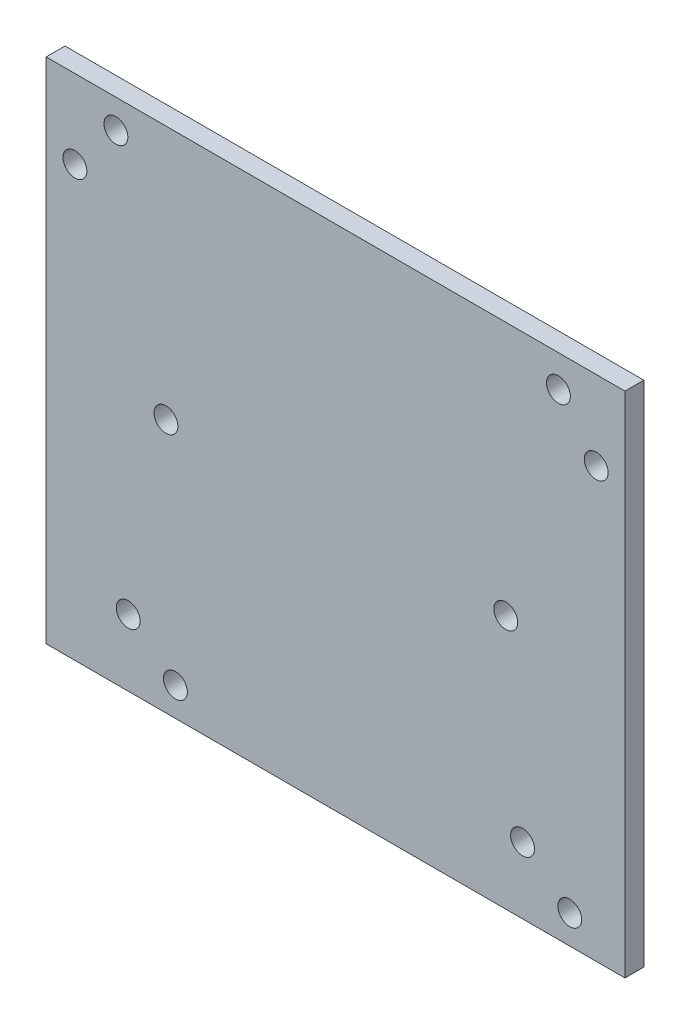
ISO-10303-21;
HEADER;
FILE_DESCRIPTION(('STEP AP214'),'2;1');
FILE_NAME('part.step','',(''),(''),'','','');
FILE_SCHEMA(('AUTOMOTIVE_DESIGN { 1 0 10303 214 1 1 1 1 }'));
ENDSEC;
DATA;
#1=APPLICATION_CONTEXT('core data for automotive mechanical design processes');
#2=APPLICATION_PROTOCOL_DEFINITION('international standard','automotive_design',2000,#1);
#3=PRODUCT_CONTEXT('',#1,'mechanical');
#4=PRODUCT('Part','Part','',(#3));
#5=PRODUCT_RELATED_PRODUCT_CATEGORY('part','',(#4));
#6=PRODUCT_DEFINITION_FORMATION('','',#4);
#7=PRODUCT_DEFINITION_CONTEXT('part definition',#1,'design');
#8=PRODUCT_DEFINITION('design','',#6,#7);
#9=PRODUCT_DEFINITION_SHAPE('','',#8);
#10=(LENGTH_UNIT() NAMED_UNIT(*) SI_UNIT(.MILLI.,.METRE.));
#11=(NAMED_UNIT(*) PLANE_ANGLE_UNIT() SI_UNIT($,.RADIAN.));
#12=(NAMED_UNIT(*) SI_UNIT($,.STERADIAN.) SOLID_ANGLE_UNIT());
#13=UNCERTAINTY_MEASURE_WITH_UNIT(LENGTH_MEASURE(1.E-05),#10,'distance_accuracy_value','');
#14=(GEOMETRIC_REPRESENTATION_CONTEXT(3) GLOBAL_UNCERTAINTY_ASSIGNED_CONTEXT((#13)) GLOBAL_UNIT_ASSIGNED_CONTEXT((#10,
#11,#12)) REPRESENTATION_CONTEXT('',''));
#15=CARTESIAN_POINT('',(0.,0.,0.));
#16=DIRECTION('',(0.,0.,1.));
#17=DIRECTION('',(1.,0.,0.));
#18=AXIS2_PLACEMENT_3D('',#15,#16,#17);
#19=CARTESIAN_POINT('',(0.,0.,6.35));
#20=DIRECTION('',(0.,0.,-1.));
#21=DIRECTION('',(-1.,0.,0.));
#22=AXIS2_PLACEMENT_3D('',#19,#20,#21);
#23=PLANE('',#22);
#24=DIRECTION('',(0.,-1.,0.));
#25=VECTOR('',#24,1.);
#26=CARTESIAN_POINT('',(862.044789876079,217.278265585855,6.35));
#27=LINE('',#26,#25);
#28=CARTESIAN_POINT('',(862.044789876079,388.233207524856,6.35));
#29=VERTEX_POINT('',#28);
#30=CARTESIAN_POINT('',(862.044789876079,217.278265585855,6.35));
#31=VERTEX_POINT('',#30);
#32=EDGE_CURVE('E91',#29,#31,#27,.T.);
#33=ORIENTED_EDGE('',*,*,#32,.T.);
#34=DIRECTION('',(1.,0.,0.));
#35=VECTOR('',#34,1.);
#36=CARTESIAN_POINT('',(862.044789876079,217.278265585855,6.35));
#37=LINE('',#36,#35);
#38=CARTESIAN_POINT('',(1056.7178425293,217.278265585855,6.35));
#39=VERTEX_POINT('',#38);
#40=EDGE_CURVE('E86',#31,#39,#37,.T.);
#41=ORIENTED_EDGE('',*,*,#40,.T.);
#42=DIRECTION('',(0.,1.,0.));
#43=VECTOR('',#42,1.);
#44=CARTESIAN_POINT('',(1056.7178425293,217.278265585855,6.35));
#45=LINE('',#44,#43);
#46=CARTESIAN_POINT('',(1056.7178425293,388.233207524856,6.35));
#47=VERTEX_POINT('',#46);
#48=EDGE_CURVE('E89',#39,#47,#45,.T.);
#49=ORIENTED_EDGE('',*,*,#48,.T.);
#50=DIRECTION('',(-1.,0.,0.));
#51=VECTOR('',#50,1.);
#52=CARTESIAN_POINT('',(862.044789876079,388.233207524856,6.35));
#53=LINE('',#52,#51);
#54=EDGE_CURVE('E56',#47,#29,#53,.T.);
#55=ORIENTED_EDGE('',*,*,#54,.T.);
#56=EDGE_LOOP('',(#33,#41,#49,#55));
#57=FACE_BOUND('',#56,.T.);
#58=CARTESIAN_POINT('',(1022.27995941321,239.653265585854,6.35));
#59=DIRECTION('',(0.,0.,1.));
#60=DIRECTION('',(1.,0.,0.));
#61=AXIS2_PLACEMENT_3D('',#58,#59,#60);
#62=CIRCLE('',#61,4.01269999999996);
#63=CARTESIAN_POINT('',(1026.29265941321,239.653265585854,6.35));
#64=VERTEX_POINT('',#63);
#65=EDGE_CURVE('E106',#64,#64,#62,.T.);
#66=ORIENTED_EDGE('',*,*,#65,.F.);
#67=EDGE_LOOP('',(#66));
#68=FACE_BOUND('',#67,.T.);
#69=CARTESIAN_POINT('',(1038.15495941321,226.953265585854,6.35));
#70=DIRECTION('',(0.,0.,1.));
#71=DIRECTION('',(1.,0.,0.));
#72=AXIS2_PLACEMENT_3D('',#69,#70,#71);
#73=CIRCLE('',#72,4.01269999999996);
#74=CARTESIAN_POINT('',(1042.16765941321,226.953265585854,6.35));
#75=VERTEX_POINT('',#74);
#76=EDGE_CURVE('E121',#75,#75,#73,.T.);
#77=ORIENTED_EDGE('',*,*,#76,.F.);
#78=EDGE_LOOP('',(#77));
#79=FACE_BOUND('',#78,.T.);
#80=CARTESIAN_POINT('',(889.644786871235,239.653265585855,6.35));
#81=DIRECTION('',(0.,0.,1.));
#82=DIRECTION('',(1.,0.,0.));
#83=AXIS2_PLACEMENT_3D('',#80,#81,#82);
#84=CIRCLE('',#83,4.01270000000008);
#85=CARTESIAN_POINT('',(893.657486871235,239.653265585855,6.35));
#86=VERTEX_POINT('',#85);
#87=EDGE_CURVE('E127',#86,#86,#84,.T.);
#88=ORIENTED_EDGE('',*,*,#87,.F.);
#89=EDGE_LOOP('',(#88));
#90=FACE_BOUND('',#89,.T.);
#91=CARTESIAN_POINT('',(1034.3338599261,377.480941448401,6.35));
#92=DIRECTION('',(0.,0.,1.));
#93=DIRECTION('',(1.,0.,0.));
#94=AXIS2_PLACEMENT_3D('',#91,#92,#93);
#95=CIRCLE('',#94,4.01270000000019);
#96=CARTESIAN_POINT('',(1038.3465599261,377.480941448401,6.35));
#97=VERTEX_POINT('',#96);
#98=EDGE_CURVE('E133',#97,#97,#95,.T.);
#99=ORIENTED_EDGE('',*,*,#98,.F.);
#100=EDGE_LOOP('',(#99));
#101=FACE_BOUND('',#100,.T.);
#102=CARTESIAN_POINT('',(1047.0428425293,361.613131700632,6.35));
#103=DIRECTION('',(0.,0.,1.));
#104=DIRECTION('',(1.,0.,0.));
#105=AXIS2_PLACEMENT_3D('',#102,#103,#104);
#106=CIRCLE('',#105,4.01270000000019);
#107=CARTESIAN_POINT('',(1051.0555425293,361.613131700632,6.35));
#108=VERTEX_POINT('',#107);
#109=EDGE_CURVE('E139',#108,#108,#106,.T.);
#110=ORIENTED_EDGE('',*,*,#109,.F.);
#111=EDGE_LOOP('',(#110));
#112=FACE_BOUND('',#111,.T.);
#113=CARTESIAN_POINT('',(871.719789876079,361.793284425073,6.35));
#114=DIRECTION('',(0.,0.,1.));
#115=DIRECTION('',(1.,0.,0.));
#116=AXIS2_PLACEMENT_3D('',#113,#114,#115);
#117=CIRCLE('',#116,4.01270000000008);
#118=CARTESIAN_POINT('',(875.732489876079,361.793284425073,6.35));
#119=VERTEX_POINT('',#118);
#120=EDGE_CURVE('E145',#119,#119,#117,.T.);
#121=ORIENTED_EDGE('',*,*,#120,.F.);
#122=EDGE_LOOP('',(#121));
#123=FACE_BOUND('',#122,.T.);
#124=CARTESIAN_POINT('',(885.505258453761,378.558207524856,6.35));
#125=DIRECTION('',(0.,0.,1.));
#126=DIRECTION('',(1.,0.,0.));
#127=AXIS2_PLACEMENT_3D('',#124,#125,#126);
#128=CIRCLE('',#127,4.01270000000008);
#129=CARTESIAN_POINT('',(889.517958453761,378.558207524856,6.35));
#130=VERTEX_POINT('',#129);
#131=EDGE_CURVE('E151',#130,#130,#128,.T.);
#132=ORIENTED_EDGE('',*,*,#131,.F.);
#133=EDGE_LOOP('',(#132));
#134=FACE_BOUND('',#133,.T.);
#135=CARTESIAN_POINT('',(905.519786871235,226.953265585855,6.35));
#136=DIRECTION('',(0.,0.,1.));
#137=DIRECTION('',(1.,0.,0.));
#138=AXIS2_PLACEMENT_3D('',#135,#136,#137);
#139=CIRCLE('',#138,4.01270000000008);
#140=CARTESIAN_POINT('',(909.532486871235,226.953265585855,6.35));
#141=VERTEX_POINT('',#140);
#142=EDGE_CURVE('E157',#141,#141,#139,.T.);
#143=ORIENTED_EDGE('',*,*,#142,.F.);
#144=EDGE_LOOP('',(#143));
#145=FACE_BOUND('',#144,.T.);
#146=CARTESIAN_POINT('',(902.338636268682,302.755736555355,6.35));
#147=DIRECTION('',(0.,0.,1.));
#148=DIRECTION('',(1.,0.,0.));
#149=AXIS2_PLACEMENT_3D('',#146,#147,#148);
#150=CIRCLE('',#149,4.01270000000008);
#151=CARTESIAN_POINT('',(906.351336268682,302.755736555355,6.35));
#152=VERTEX_POINT('',#151);
#153=EDGE_CURVE('E163',#152,#152,#150,.T.);
#154=ORIENTED_EDGE('',*,*,#153,.F.);
#155=EDGE_LOOP('',(#154));
#156=FACE_BOUND('',#155,.T.);
#157=CARTESIAN_POINT('',(1016.63863626868,302.755736555355,6.35));
#158=DIRECTION('',(0.,0.,1.));
#159=DIRECTION('',(-1.,0.,0.));
#160=AXIS2_PLACEMENT_3D('',#157,#158,#159);
#161=CIRCLE('',#160,4.01270000000019);
#162=CARTESIAN_POINT('',(1012.62593626868,302.755736555355,6.35));
#163=VERTEX_POINT('',#162);
#164=EDGE_CURVE('E169',#163,#163,#161,.T.);
#165=ORIENTED_EDGE('',*,*,#164,.F.);
#166=EDGE_LOOP('',(#165));
#167=FACE_BOUND('',#166,.T.);
#168=ADVANCED_FACE('F39',(#57,#68,#79,#90,#101,#112,#123,#134,#145,#156,#167),#23,.F.);
#169=CARTESIAN_POINT('',(0.,0.,0.));
#170=DIRECTION('',(0.,0.,-1.));
#171=DIRECTION('',(-1.,0.,0.));
#172=AXIS2_PLACEMENT_3D('',#169,#170,#171);
#173=PLANE('',#172);
#174=CARTESIAN_POINT('',(902.338636268682,302.755736555355,0.));
#175=DIRECTION('',(0.,0.,1.));
#176=DIRECTION('',(1.,0.,0.));
#177=AXIS2_PLACEMENT_3D('',#174,#175,#176);
#178=CIRCLE('',#177,4.01270000000008);
#179=CARTESIAN_POINT('',(906.351336268682,302.755736555355,0.));
#180=VERTEX_POINT('',#179);
#181=EDGE_CURVE('E166',#180,#180,#178,.T.);
#182=ORIENTED_EDGE('',*,*,#181,.T.);
#183=EDGE_LOOP('',(#182));
#184=FACE_BOUND('',#183,.T.);
#185=CARTESIAN_POINT('',(885.505258453761,378.558207524856,0.));
#186=DIRECTION('',(0.,0.,1.));
#187=DIRECTION('',(1.,0.,0.));
#188=AXIS2_PLACEMENT_3D('',#185,#186,#187);
#189=CIRCLE('',#188,4.01270000000008);
#190=CARTESIAN_POINT('',(889.517958453761,378.558207524856,0.));
#191=VERTEX_POINT('',#190);
#192=EDGE_CURVE('E154',#191,#191,#189,.T.);
#193=ORIENTED_EDGE('',*,*,#192,.T.);
#194=EDGE_LOOP('',(#193));
#195=FACE_BOUND('',#194,.T.);
#196=CARTESIAN_POINT('',(1047.0428425293,361.613131700632,0.));
#197=DIRECTION('',(0.,0.,1.));
#198=DIRECTION('',(1.,0.,0.));
#199=AXIS2_PLACEMENT_3D('',#196,#197,#198);
#200=CIRCLE('',#199,4.01270000000019);
#201=CARTESIAN_POINT('',(1051.0555425293,361.613131700632,0.));
#202=VERTEX_POINT('',#201);
#203=EDGE_CURVE('E142',#202,#202,#200,.T.);
#204=ORIENTED_EDGE('',*,*,#203,.T.);
#205=EDGE_LOOP('',(#204));
#206=FACE_BOUND('',#205,.T.);
#207=CARTESIAN_POINT('',(889.644786871235,239.653265585855,0.));
#208=DIRECTION('',(0.,0.,1.));
#209=DIRECTION('',(1.,0.,0.));
#210=AXIS2_PLACEMENT_3D('',#207,#208,#209);
#211=CIRCLE('',#210,4.01270000000008);
#212=CARTESIAN_POINT('',(893.657486871235,239.653265585855,0.));
#213=VERTEX_POINT('',#212);
#214=EDGE_CURVE('E130',#213,#213,#211,.T.);
#215=ORIENTED_EDGE('',*,*,#214,.T.);
#216=EDGE_LOOP('',(#215));
#217=FACE_BOUND('',#216,.T.);
#218=CARTESIAN_POINT('',(1022.27995941321,239.653265585854,0.));
#219=DIRECTION('',(0.,0.,1.));
#220=DIRECTION('',(1.,0.,0.));
#221=AXIS2_PLACEMENT_3D('',#218,#219,#220);
#222=CIRCLE('',#221,4.01269999999996);
#223=CARTESIAN_POINT('',(1026.29265941321,239.653265585854,0.));
#224=VERTEX_POINT('',#223);
#225=EDGE_CURVE('E118',#224,#224,#222,.T.);
#226=ORIENTED_EDGE('',*,*,#225,.T.);
#227=EDGE_LOOP('',(#226));
#228=FACE_BOUND('',#227,.T.);
#229=DIRECTION('',(0.,-1.,0.));
#230=VECTOR('',#229,1.);
#231=CARTESIAN_POINT('',(862.044789876079,217.278265585855,0.));
#232=LINE('',#231,#230);
#233=CARTESIAN_POINT('',(862.044789876079,388.233207524856,0.));
#234=VERTEX_POINT('',#233);
#235=CARTESIAN_POINT('',(862.044789876079,217.278265585855,0.));
#236=VERTEX_POINT('',#235);
#237=EDGE_CURVE('E103',#234,#236,#232,.T.);
#238=ORIENTED_EDGE('',*,*,#237,.F.);
#239=DIRECTION('',(-1.,0.,0.));
#240=VECTOR('',#239,1.);
#241=CARTESIAN_POINT('',(862.044789876079,388.233207524856,0.));
#242=LINE('',#241,#240);
#243=CARTESIAN_POINT('',(1056.7178425293,388.233207524856,0.));
#244=VERTEX_POINT('',#243);
#245=EDGE_CURVE('E79',#244,#234,#242,.T.);
#246=ORIENTED_EDGE('',*,*,#245,.F.);
#247=DIRECTION('',(0.,1.,0.));
#248=VECTOR('',#247,1.);
#249=CARTESIAN_POINT('',(1056.7178425293,217.278265585855,0.));
#250=LINE('',#249,#248);
#251=CARTESIAN_POINT('',(1056.7178425293,217.278265585855,0.));
#252=VERTEX_POINT('',#251);
#253=EDGE_CURVE('E73',#252,#244,#250,.T.);
#254=ORIENTED_EDGE('',*,*,#253,.F.);
#255=DIRECTION('',(1.,0.,0.));
#256=VECTOR('',#255,1.);
#257=CARTESIAN_POINT('',(862.044789876079,217.278265585855,0.));
#258=LINE('',#257,#256);
#259=EDGE_CURVE('E95',#236,#252,#258,.T.);
#260=ORIENTED_EDGE('',*,*,#259,.F.);
#261=EDGE_LOOP('',(#238,#246,#254,#260));
#262=FACE_BOUND('',#261,.T.);
#263=CARTESIAN_POINT('',(1038.15495941321,226.953265585854,0.));
#264=DIRECTION('',(0.,0.,1.));
#265=DIRECTION('',(1.,0.,0.));
#266=AXIS2_PLACEMENT_3D('',#263,#264,#265);
#267=CIRCLE('',#266,4.01269999999996);
#268=CARTESIAN_POINT('',(1042.16765941321,226.953265585854,0.));
#269=VERTEX_POINT('',#268);
#270=EDGE_CURVE('E124',#269,#269,#267,.T.);
#271=ORIENTED_EDGE('',*,*,#270,.T.);
#272=EDGE_LOOP('',(#271));
#273=FACE_BOUND('',#272,.T.);
#274=CARTESIAN_POINT('',(1034.3338599261,377.480941448401,0.));
#275=DIRECTION('',(0.,0.,1.));
#276=DIRECTION('',(1.,0.,0.));
#277=AXIS2_PLACEMENT_3D('',#274,#275,#276);
#278=CIRCLE('',#277,4.01270000000019);
#279=CARTESIAN_POINT('',(1038.3465599261,377.480941448401,0.));
#280=VERTEX_POINT('',#279);
#281=EDGE_CURVE('E136',#280,#280,#278,.T.);
#282=ORIENTED_EDGE('',*,*,#281,.T.);
#283=EDGE_LOOP('',(#282));
#284=FACE_BOUND('',#283,.T.);
#285=CARTESIAN_POINT('',(871.719789876079,361.793284425073,0.));
#286=DIRECTION('',(0.,0.,1.));
#287=DIRECTION('',(1.,0.,0.));
#288=AXIS2_PLACEMENT_3D('',#285,#286,#287);
#289=CIRCLE('',#288,4.01270000000008);
#290=CARTESIAN_POINT('',(875.732489876079,361.793284425073,0.));
#291=VERTEX_POINT('',#290);
#292=EDGE_CURVE('E148',#291,#291,#289,.T.);
#293=ORIENTED_EDGE('',*,*,#292,.T.);
#294=EDGE_LOOP('',(#293));
#295=FACE_BOUND('',#294,.T.);
#296=CARTESIAN_POINT('',(905.519786871235,226.953265585855,0.));
#297=DIRECTION('',(0.,0.,1.));
#298=DIRECTION('',(1.,0.,0.));
#299=AXIS2_PLACEMENT_3D('',#296,#297,#298);
#300=CIRCLE('',#299,4.01270000000008);
#301=CARTESIAN_POINT('',(909.532486871235,226.953265585855,0.));
#302=VERTEX_POINT('',#301);
#303=EDGE_CURVE('E160',#302,#302,#300,.T.);
#304=ORIENTED_EDGE('',*,*,#303,.T.);
#305=EDGE_LOOP('',(#304));
#306=FACE_BOUND('',#305,.T.);
#307=CARTESIAN_POINT('',(1016.63863626868,302.755736555355,0.));
#308=DIRECTION('',(0.,0.,1.));
#309=DIRECTION('',(-1.,0.,0.));
#310=AXIS2_PLACEMENT_3D('',#307,#308,#309);
#311=CIRCLE('',#310,4.01270000000019);
#312=CARTESIAN_POINT('',(1012.62593626868,302.755736555355,0.));
#313=VERTEX_POINT('',#312);
#314=EDGE_CURVE('E172',#313,#313,#311,.T.);
#315=ORIENTED_EDGE('',*,*,#314,.T.);
#316=EDGE_LOOP('',(#315));
#317=FACE_BOUND('',#316,.T.);
#318=ADVANCED_FACE('F114',(#184,#195,#206,#217,#228,#262,#273,#284,#295,#306,#317),#173,.T.);
#319=CARTESIAN_POINT('',(862.044789876079,217.278265585855,6.35));
#320=DIRECTION('',(1.,0.,0.));
#321=DIRECTION('',(0.,0.,-1.));
#322=AXIS2_PLACEMENT_3D('',#319,#320,#321);
#323=PLANE('',#322);
#324=ORIENTED_EDGE('',*,*,#237,.T.);
#325=DIRECTION('',(0.,0.,-1.));
#326=VECTOR('',#325,1.);
#327=CARTESIAN_POINT('',(862.044789876079,217.278265585855,6.35));
#328=LINE('',#327,#326);
#329=EDGE_CURVE('E11',#31,#236,#328,.T.);
#330=ORIENTED_EDGE('',*,*,#329,.F.);
#331=ORIENTED_EDGE('',*,*,#32,.F.);
#332=DIRECTION('',(0.,0.,-1.));
#333=VECTOR('',#332,1.);
#334=CARTESIAN_POINT('',(862.044789876079,388.233207524856,6.35));
#335=LINE('',#334,#333);
#336=EDGE_CURVE('E99',#29,#234,#335,.T.);
#337=ORIENTED_EDGE('',*,*,#336,.T.);
#338=EDGE_LOOP('',(#324,#330,#331,#337));
#339=FACE_BOUND('',#338,.T.);
#340=ADVANCED_FACE('F41',(#339),#323,.F.);
#341=CARTESIAN_POINT('',(862.044789876079,217.278265585855,6.35));
#342=DIRECTION('',(0.,1.,0.));
#343=DIRECTION('',(0.,0.,1.));
#344=AXIS2_PLACEMENT_3D('',#341,#342,#343);
#345=PLANE('',#344);
#346=ORIENTED_EDGE('',*,*,#259,.T.);
#347=DIRECTION('',(0.,0.,-1.));
#348=VECTOR('',#347,1.);
#349=CARTESIAN_POINT('',(1056.7178425293,217.278265585855,6.35));
#350=LINE('',#349,#348);
#351=EDGE_CURVE('E48',#39,#252,#350,.T.);
#352=ORIENTED_EDGE('',*,*,#351,.F.);
#353=ORIENTED_EDGE('',*,*,#40,.F.);
#354=ORIENTED_EDGE('',*,*,#329,.T.);
#355=EDGE_LOOP('',(#346,#352,#353,#354));
#356=FACE_BOUND('',#355,.T.);
#357=ADVANCED_FACE('F94',(#356),#345,.F.);
#358=CARTESIAN_POINT('',(1056.7178425293,217.278265585855,6.35));
#359=DIRECTION('',(-1.,0.,0.));
#360=DIRECTION('',(0.,0.,1.));
#361=AXIS2_PLACEMENT_3D('',#358,#359,#360);
#362=PLANE('',#361);
#363=ORIENTED_EDGE('',*,*,#253,.T.);
#364=DIRECTION('',(0.,0.,-1.));
#365=VECTOR('',#364,1.);
#366=CARTESIAN_POINT('',(1056.7178425293,388.233207524856,6.35));
#367=LINE('',#366,#365);
#368=EDGE_CURVE('E96',#47,#244,#367,.T.);
#369=ORIENTED_EDGE('',*,*,#368,.F.);
#370=ORIENTED_EDGE('',*,*,#48,.F.);
#371=ORIENTED_EDGE('',*,*,#351,.T.);
#372=EDGE_LOOP('',(#363,#369,#370,#371));
#373=FACE_BOUND('',#372,.T.);
#374=ADVANCED_FACE('F97',(#373),#362,.F.);
#375=CARTESIAN_POINT('',(862.044789876079,388.233207524856,6.35));
#376=DIRECTION('',(0.,-1.,0.));
#377=DIRECTION('',(0.,0.,-1.));
#378=AXIS2_PLACEMENT_3D('',#375,#376,#377);
#379=PLANE('',#378);
#380=ORIENTED_EDGE('',*,*,#245,.T.);
#381=ORIENTED_EDGE('',*,*,#336,.F.);
#382=ORIENTED_EDGE('',*,*,#54,.F.);
#383=ORIENTED_EDGE('',*,*,#368,.T.);
#384=EDGE_LOOP('',(#380,#381,#382,#383));
#385=FACE_BOUND('',#384,.T.);
#386=ADVANCED_FACE('F111',(#385),#379,.F.);
#387=CARTESIAN_POINT('',(1022.27995941321,239.653265585854,6.35));
#388=DIRECTION('',(0.,0.,-1.));
#389=DIRECTION('',(-1.,0.,0.));
#390=AXIS2_PLACEMENT_3D('',#387,#388,#389);
#391=CYLINDRICAL_SURFACE('',#390,4.01269999999996);
#392=ORIENTED_EDGE('',*,*,#65,.T.);
#393=EDGE_LOOP('',(#392));
#394=FACE_BOUND('',#393,.T.);
#395=ORIENTED_EDGE('',*,*,#225,.F.);
#396=EDGE_LOOP('',(#395));
#397=FACE_BOUND('',#396,.T.);
#398=ADVANCED_FACE('F189',(#394,#397),#391,.F.);
#399=CARTESIAN_POINT('',(1038.15495941321,226.953265585854,6.35));
#400=DIRECTION('',(0.,0.,-1.));
#401=DIRECTION('',(-1.,0.,0.));
#402=AXIS2_PLACEMENT_3D('',#399,#400,#401);
#403=CYLINDRICAL_SURFACE('',#402,4.01269999999996);
#404=ORIENTED_EDGE('',*,*,#76,.T.);
#405=EDGE_LOOP('',(#404));
#406=FACE_BOUND('',#405,.T.);
#407=ORIENTED_EDGE('',*,*,#270,.F.);
#408=EDGE_LOOP('',(#407));
#409=FACE_BOUND('',#408,.T.);
#410=ADVANCED_FACE('F234',(#406,#409),#403,.F.);
#411=CARTESIAN_POINT('',(889.644786871235,239.653265585855,6.35));
#412=DIRECTION('',(0.,0.,-1.));
#413=DIRECTION('',(-1.,0.,0.));
#414=AXIS2_PLACEMENT_3D('',#411,#412,#413);
#415=CYLINDRICAL_SURFACE('',#414,4.01270000000008);
#416=ORIENTED_EDGE('',*,*,#87,.T.);
#417=EDGE_LOOP('',(#416));
#418=FACE_BOUND('',#417,.T.);
#419=ORIENTED_EDGE('',*,*,#214,.F.);
#420=EDGE_LOOP('',(#419));
#421=FACE_BOUND('',#420,.T.);
#422=ADVANCED_FACE('F242',(#418,#421),#415,.F.);
#423=CARTESIAN_POINT('',(1034.3338599261,377.480941448401,6.35));
#424=DIRECTION('',(0.,0.,-1.));
#425=DIRECTION('',(-1.,0.,0.));
#426=AXIS2_PLACEMENT_3D('',#423,#424,#425);
#427=CYLINDRICAL_SURFACE('',#426,4.01270000000019);
#428=ORIENTED_EDGE('',*,*,#98,.T.);
#429=EDGE_LOOP('',(#428));
#430=FACE_BOUND('',#429,.T.);
#431=ORIENTED_EDGE('',*,*,#281,.F.);
#432=EDGE_LOOP('',(#431));
#433=FACE_BOUND('',#432,.T.);
#434=ADVANCED_FACE('F250',(#430,#433),#427,.F.);
#435=CARTESIAN_POINT('',(1047.0428425293,361.613131700632,6.35));
#436=DIRECTION('',(0.,0.,-1.));
#437=DIRECTION('',(-1.,0.,0.));
#438=AXIS2_PLACEMENT_3D('',#435,#436,#437);
#439=CYLINDRICAL_SURFACE('',#438,4.01270000000019);
#440=ORIENTED_EDGE('',*,*,#109,.T.);
#441=EDGE_LOOP('',(#440));
#442=FACE_BOUND('',#441,.T.);
#443=ORIENTED_EDGE('',*,*,#203,.F.);
#444=EDGE_LOOP('',(#443));
#445=FACE_BOUND('',#444,.T.);
#446=ADVANCED_FACE('F259',(#442,#445),#439,.F.);
#447=CARTESIAN_POINT('',(871.719789876079,361.793284425073,6.35));
#448=DIRECTION('',(0.,0.,-1.));
#449=DIRECTION('',(-1.,0.,0.));
#450=AXIS2_PLACEMENT_3D('',#447,#448,#449);
#451=CYLINDRICAL_SURFACE('',#450,4.01270000000008);
#452=ORIENTED_EDGE('',*,*,#120,.T.);
#453=EDGE_LOOP('',(#452));
#454=FACE_BOUND('',#453,.T.);
#455=ORIENTED_EDGE('',*,*,#292,.F.);
#456=EDGE_LOOP('',(#455));
#457=FACE_BOUND('',#456,.T.);
#458=ADVANCED_FACE('F268',(#454,#457),#451,.F.);
#459=CARTESIAN_POINT('',(885.505258453761,378.558207524856,6.35));
#460=DIRECTION('',(0.,0.,-1.));
#461=DIRECTION('',(-1.,0.,0.));
#462=AXIS2_PLACEMENT_3D('',#459,#460,#461);
#463=CYLINDRICAL_SURFACE('',#462,4.01270000000008);
#464=ORIENTED_EDGE('',*,*,#131,.T.);
#465=EDGE_LOOP('',(#464));
#466=FACE_BOUND('',#465,.T.);
#467=ORIENTED_EDGE('',*,*,#192,.F.);
#468=EDGE_LOOP('',(#467));
#469=FACE_BOUND('',#468,.T.);
#470=ADVANCED_FACE('F277',(#466,#469),#463,.F.);
#471=CARTESIAN_POINT('',(905.519786871235,226.953265585855,6.35));
#472=DIRECTION('',(0.,0.,-1.));
#473=DIRECTION('',(-1.,0.,0.));
#474=AXIS2_PLACEMENT_3D('',#471,#472,#473);
#475=CYLINDRICAL_SURFACE('',#474,4.01270000000008);
#476=ORIENTED_EDGE('',*,*,#142,.T.);
#477=EDGE_LOOP('',(#476));
#478=FACE_BOUND('',#477,.T.);
#479=ORIENTED_EDGE('',*,*,#303,.F.);
#480=EDGE_LOOP('',(#479));
#481=FACE_BOUND('',#480,.T.);
#482=ADVANCED_FACE('F286',(#478,#481),#475,.F.);
#483=CARTESIAN_POINT('',(902.338636268682,302.755736555355,6.35));
#484=DIRECTION('',(0.,0.,-1.));
#485=DIRECTION('',(-1.,0.,0.));
#486=AXIS2_PLACEMENT_3D('',#483,#484,#485);
#487=CYLINDRICAL_SURFACE('',#486,4.01270000000008);
#488=ORIENTED_EDGE('',*,*,#153,.T.);
#489=EDGE_LOOP('',(#488));
#490=FACE_BOUND('',#489,.T.);
#491=ORIENTED_EDGE('',*,*,#181,.F.);
#492=EDGE_LOOP('',(#491));
#493=FACE_BOUND('',#492,.T.);
#494=ADVANCED_FACE('F295',(#490,#493),#487,.F.);
#495=CARTESIAN_POINT('',(1016.63863626868,302.755736555355,6.35));
#496=DIRECTION('',(0.,0.,-1.));
#497=DIRECTION('',(-1.,0.,0.));
#498=AXIS2_PLACEMENT_3D('',#495,#496,#497);
#499=CYLINDRICAL_SURFACE('',#498,4.01270000000019);
#500=ORIENTED_EDGE('',*,*,#164,.T.);
#501=EDGE_LOOP('',(#500));
#502=FACE_BOUND('',#501,.T.);
#503=ORIENTED_EDGE('',*,*,#314,.F.);
#504=EDGE_LOOP('',(#503));
#505=FACE_BOUND('',#504,.T.);
#506=ADVANCED_FACE('F178',(#502,#505),#499,.F.);
#507=CLOSED_SHELL('',(#168,#318,#340,#357,#374,#386,#398,#410,#422,#434,#446,#458,#470,#482,
#494,#506));
#508=MANIFOLD_SOLID_BREP('B2',#507);
#509=ADVANCED_BREP_SHAPE_REPRESENTATION('',(#18,#508),#14);
#510=SHAPE_DEFINITION_REPRESENTATION(#9,#509);
ENDSEC;
END-ISO-10303-21;
